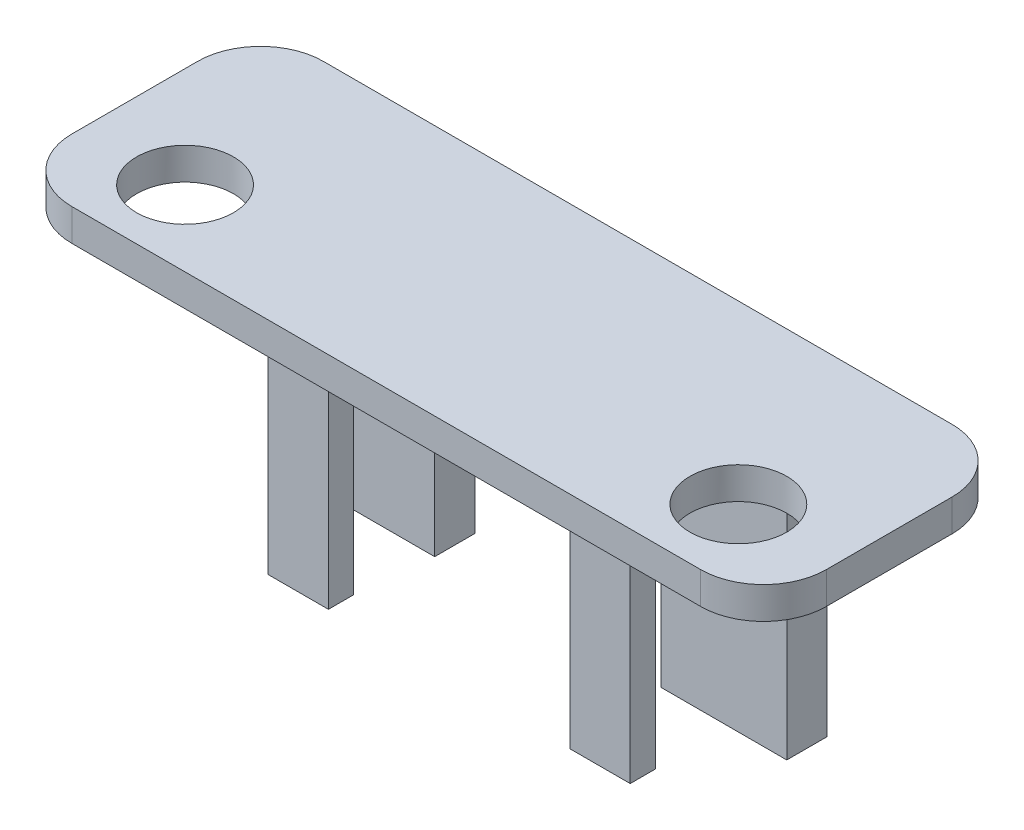
ISO-10303-21;
HEADER;
FILE_DESCRIPTION(('STEP AP214'),'2;1');
FILE_NAME('part.step','',(''),(''),'','','');
FILE_SCHEMA(('AUTOMOTIVE_DESIGN { 1 0 10303 214 1 1 1 1 }'));
ENDSEC;
DATA;
#1=APPLICATION_CONTEXT('core data for automotive mechanical design processes');
#2=APPLICATION_PROTOCOL_DEFINITION('international standard','automotive_design',2000,#1);
#3=PRODUCT_CONTEXT('',#1,'mechanical');
#4=PRODUCT('Part','Part','',(#3));
#5=PRODUCT_RELATED_PRODUCT_CATEGORY('part','',(#4));
#6=PRODUCT_DEFINITION_FORMATION('','',#4);
#7=PRODUCT_DEFINITION_CONTEXT('part definition',#1,'design');
#8=PRODUCT_DEFINITION('design','',#6,#7);
#9=PRODUCT_DEFINITION_SHAPE('','',#8);
#10=(LENGTH_UNIT() NAMED_UNIT(*) SI_UNIT(.MILLI.,.METRE.));
#11=(NAMED_UNIT(*) PLANE_ANGLE_UNIT() SI_UNIT($,.RADIAN.));
#12=(NAMED_UNIT(*) SI_UNIT($,.STERADIAN.) SOLID_ANGLE_UNIT());
#13=UNCERTAINTY_MEASURE_WITH_UNIT(LENGTH_MEASURE(1.E-05),#10,'distance_accuracy_value','');
#14=(GEOMETRIC_REPRESENTATION_CONTEXT(3) GLOBAL_UNCERTAINTY_ASSIGNED_CONTEXT((#13)) GLOBAL_UNIT_ASSIGNED_CONTEXT((#10,
#11,#12)) REPRESENTATION_CONTEXT('',''));
#15=CARTESIAN_POINT('',(0.,0.,0.));
#16=DIRECTION('',(0.,0.,1.));
#17=DIRECTION('',(1.,0.,0.));
#18=AXIS2_PLACEMENT_3D('',#15,#16,#17);
#19=CARTESIAN_POINT('',(0.,0.,0.));
#20=DIRECTION('',(0.,-1.,0.));
#21=DIRECTION('',(0.,0.,-1.));
#22=AXIS2_PLACEMENT_3D('',#19,#20,#21);
#23=PLANE('',#22);
#24=CARTESIAN_POINT('',(-22.,0.,4.));
#25=DIRECTION('',(0.,-1.,0.));
#26=DIRECTION('',(0.,0.,-1.));
#27=AXIS2_PLACEMENT_3D('',#24,#25,#26);
#28=CIRCLE('',#27,3.85);
#29=CARTESIAN_POINT('',(-22.,0.,0.150000000000001));
#30=VERTEX_POINT('',#29);
#31=EDGE_CURVE('E390',#30,#30,#28,.T.);
#32=ORIENTED_EDGE('',*,*,#31,.F.);
#33=EDGE_LOOP('',(#32));
#34=FACE_BOUND('',#33,.T.);
#35=CARTESIAN_POINT('',(22.,0.,4.));
#36=DIRECTION('',(0.,-1.,0.));
#37=DIRECTION('',(0.,0.,-1.));
#38=AXIS2_PLACEMENT_3D('',#35,#36,#37);
#39=CIRCLE('',#38,3.85);
#40=CARTESIAN_POINT('',(22.,0.,0.150000000000001));
#41=VERTEX_POINT('',#40);
#42=EDGE_CURVE('E365',#41,#41,#39,.T.);
#43=ORIENTED_EDGE('',*,*,#42,.F.);
#44=EDGE_LOOP('',(#43));
#45=FACE_BOUND('',#44,.T.);
#46=DIRECTION('',(0.,0.,1.));
#47=VECTOR('',#46,1.);
#48=CARTESIAN_POINT('',(-30.,0.,10.));
#49=LINE('',#48,#47);
#50=CARTESIAN_POINT('',(-30.,0.,-5.));
#51=VERTEX_POINT('',#50);
#52=CARTESIAN_POINT('',(-30.,0.,5.));
#53=VERTEX_POINT('',#52);
#54=EDGE_CURVE('E394',#51,#53,#49,.T.);
#55=ORIENTED_EDGE('',*,*,#54,.F.);
#56=CARTESIAN_POINT('',(-25.,0.,-5.));
#57=DIRECTION('',(0.,-1.,0.));
#58=DIRECTION('',(0.,0.,-1.));
#59=AXIS2_PLACEMENT_3D('',#56,#57,#58);
#60=CIRCLE('',#59,5.);
#61=CARTESIAN_POINT('',(-25.,0.,-10.));
#62=VERTEX_POINT('',#61);
#63=EDGE_CURVE('E421',#51,#62,#60,.T.);
#64=ORIENTED_EDGE('',*,*,#63,.T.);
#65=DIRECTION('',(-1.,0.,0.));
#66=VECTOR('',#65,1.);
#67=CARTESIAN_POINT('',(-30.,0.,-10.));
#68=LINE('',#67,#66);
#69=CARTESIAN_POINT('',(25.,0.,-10.));
#70=VERTEX_POINT('',#69);
#71=EDGE_CURVE('E389',#70,#62,#68,.T.);
#72=ORIENTED_EDGE('',*,*,#71,.F.);
#73=CARTESIAN_POINT('',(25.,0.,-5.));
#74=DIRECTION('',(0.,-1.,0.));
#75=DIRECTION('',(0.,0.,-1.));
#76=AXIS2_PLACEMENT_3D('',#73,#74,#75);
#77=CIRCLE('',#76,5.);
#78=CARTESIAN_POINT('',(30.,0.,-5.));
#79=VERTEX_POINT('',#78);
#80=EDGE_CURVE('E412',#70,#79,#77,.T.);
#81=ORIENTED_EDGE('',*,*,#80,.T.);
#82=DIRECTION('',(0.,0.,-1.));
#83=VECTOR('',#82,1.);
#84=CARTESIAN_POINT('',(30.,0.,10.));
#85=LINE('',#84,#83);
#86=CARTESIAN_POINT('',(30.,0.,5.));
#87=VERTEX_POINT('',#86);
#88=EDGE_CURVE('E385',#87,#79,#85,.T.);
#89=ORIENTED_EDGE('',*,*,#88,.F.);
#90=CARTESIAN_POINT('',(25.,0.,5.));
#91=DIRECTION('',(0.,-1.,0.));
#92=DIRECTION('',(0.,0.,-1.));
#93=AXIS2_PLACEMENT_3D('',#90,#91,#92);
#94=CIRCLE('',#93,5.);
#95=CARTESIAN_POINT('',(25.,0.,10.));
#96=VERTEX_POINT('',#95);
#97=EDGE_CURVE('E415',#87,#96,#94,.T.);
#98=ORIENTED_EDGE('',*,*,#97,.T.);
#99=DIRECTION('',(1.,0.,0.));
#100=VECTOR('',#99,1.);
#101=CARTESIAN_POINT('',(-30.,0.,10.));
#102=LINE('',#101,#100);
#103=CARTESIAN_POINT('',(-25.,0.,10.));
#104=VERTEX_POINT('',#103);
#105=EDGE_CURVE('E374',#104,#96,#102,.T.);
#106=ORIENTED_EDGE('',*,*,#105,.F.);
#107=CARTESIAN_POINT('',(-25.,0.,5.));
#108=DIRECTION('',(0.,-1.,0.));
#109=DIRECTION('',(0.,0.,-1.));
#110=AXIS2_PLACEMENT_3D('',#107,#108,#109);
#111=CIRCLE('',#110,5.);
#112=EDGE_CURVE('E418',#104,#53,#111,.T.);
#113=ORIENTED_EDGE('',*,*,#112,.T.);
#114=EDGE_LOOP('',(#55,#64,#72,#81,#89,#98,#106,#113));
#115=FACE_BOUND('',#114,.T.);
#116=DIRECTION('',(-1.,0.,0.));
#117=VECTOR('',#116,1.);
#118=CARTESIAN_POINT('',(-14.4,0.,5.));
#119=LINE('',#118,#117);
#120=CARTESIAN_POINT('',(-9.6,0.,5.));
#121=VERTEX_POINT('',#120);
#122=CARTESIAN_POINT('',(-14.4,0.,5.));
#123=VERTEX_POINT('',#122);
#124=EDGE_CURVE('E338',#121,#123,#119,.T.);
#125=ORIENTED_EDGE('',*,*,#124,.F.);
#126=DIRECTION('',(0.,0.,1.));
#127=VECTOR('',#126,1.);
#128=CARTESIAN_POINT('',(-9.6,0.,3.));
#129=LINE('',#128,#127);
#130=CARTESIAN_POINT('',(-9.6,0.,3.));
#131=VERTEX_POINT('',#130);
#132=EDGE_CURVE('E319',#131,#121,#129,.T.);
#133=ORIENTED_EDGE('',*,*,#132,.F.);
#134=DIRECTION('',(1.,0.,0.));
#135=VECTOR('',#134,1.);
#136=CARTESIAN_POINT('',(-14.4,0.,3.));
#137=LINE('',#136,#135);
#138=CARTESIAN_POINT('',(-14.4,0.,3.));
#139=VERTEX_POINT('',#138);
#140=EDGE_CURVE('E325',#139,#131,#137,.T.);
#141=ORIENTED_EDGE('',*,*,#140,.F.);
#142=DIRECTION('',(0.,0.,-1.));
#143=VECTOR('',#142,1.);
#144=CARTESIAN_POINT('',(-14.4,0.,3.));
#145=LINE('',#144,#143);
#146=EDGE_CURVE('E341',#123,#139,#145,.T.);
#147=ORIENTED_EDGE('',*,*,#146,.F.);
#148=EDGE_LOOP('',(#125,#133,#141,#147));
#149=FACE_BOUND('',#148,.T.);
#150=DIRECTION('',(-1.,0.,0.));
#151=VECTOR('',#150,1.);
#152=CARTESIAN_POINT('',(9.6,0.,5.));
#153=LINE('',#152,#151);
#154=CARTESIAN_POINT('',(14.4,0.,5.));
#155=VERTEX_POINT('',#154);
#156=CARTESIAN_POINT('',(9.6,0.,5.));
#157=VERTEX_POINT('',#156);
#158=EDGE_CURVE('E297',#155,#157,#153,.T.);
#159=ORIENTED_EDGE('',*,*,#158,.F.);
#160=DIRECTION('',(0.,0.,1.));
#161=VECTOR('',#160,1.);
#162=CARTESIAN_POINT('',(14.4,0.,3.));
#163=LINE('',#162,#161);
#164=CARTESIAN_POINT('',(14.4,0.,3.));
#165=VERTEX_POINT('',#164);
#166=EDGE_CURVE('E278',#165,#155,#163,.T.);
#167=ORIENTED_EDGE('',*,*,#166,.F.);
#168=DIRECTION('',(1.,0.,0.));
#169=VECTOR('',#168,1.);
#170=CARTESIAN_POINT('',(9.6,0.,3.));
#171=LINE('',#170,#169);
#172=CARTESIAN_POINT('',(9.6,0.,3.));
#173=VERTEX_POINT('',#172);
#174=EDGE_CURVE('E284',#173,#165,#171,.T.);
#175=ORIENTED_EDGE('',*,*,#174,.F.);
#176=DIRECTION('',(0.,0.,-1.));
#177=VECTOR('',#176,1.);
#178=CARTESIAN_POINT('',(9.6,0.,3.));
#179=LINE('',#178,#177);
#180=EDGE_CURVE('E300',#157,#173,#179,.T.);
#181=ORIENTED_EDGE('',*,*,#180,.F.);
#182=EDGE_LOOP('',(#159,#167,#175,#181));
#183=FACE_BOUND('',#182,.T.);
#184=DIRECTION('',(1.,0.,0.));
#185=VECTOR('',#184,1.);
#186=CARTESIAN_POINT('',(-19.,0.,-6.05));
#187=LINE('',#186,#185);
#188=CARTESIAN_POINT('',(-19.,0.,-6.05));
#189=VERTEX_POINT('',#188);
#190=CARTESIAN_POINT('',(-9.,0.,-6.05));
#191=VERTEX_POINT('',#190);
#192=EDGE_CURVE('E236',#189,#191,#187,.T.);
#193=ORIENTED_EDGE('',*,*,#192,.F.);
#194=DIRECTION('',(0.,0.,-1.));
#195=VECTOR('',#194,1.);
#196=CARTESIAN_POINT('',(-19.,0.,-6.05));
#197=LINE('',#196,#195);
#198=CARTESIAN_POINT('',(-19.,0.,-2.85));
#199=VERTEX_POINT('',#198);
#200=EDGE_CURVE('E231',#199,#189,#197,.T.);
#201=ORIENTED_EDGE('',*,*,#200,.F.);
#202=DIRECTION('',(-1.,0.,0.));
#203=VECTOR('',#202,1.);
#204=CARTESIAN_POINT('',(-19.,0.,-2.85));
#205=LINE('',#204,#203);
#206=CARTESIAN_POINT('',(-9.,0.,-2.85));
#207=VERTEX_POINT('',#206);
#208=EDGE_CURVE('E247',#207,#199,#205,.T.);
#209=ORIENTED_EDGE('',*,*,#208,.F.);
#210=DIRECTION('',(0.,0.,1.));
#211=VECTOR('',#210,1.);
#212=CARTESIAN_POINT('',(-9.,0.,-6.05));
#213=LINE('',#212,#211);
#214=EDGE_CURVE('E259',#191,#207,#213,.T.);
#215=ORIENTED_EDGE('',*,*,#214,.F.);
#216=EDGE_LOOP('',(#193,#201,#209,#215));
#217=FACE_BOUND('',#216,.T.);
#218=DIRECTION('',(0.,0.,-1.));
#219=VECTOR('',#218,1.);
#220=CARTESIAN_POINT('',(9.,0.,-6.05));
#221=LINE('',#220,#219);
#222=CARTESIAN_POINT('',(9.,0.,-2.85));
#223=VERTEX_POINT('',#222);
#224=CARTESIAN_POINT('',(9.,0.,-6.05));
#225=VERTEX_POINT('',#224);
#226=EDGE_CURVE('E805',#223,#225,#221,.T.);
#227=ORIENTED_EDGE('',*,*,#226,.F.);
#228=DIRECTION('',(-1.,0.,0.));
#229=VECTOR('',#228,1.);
#230=CARTESIAN_POINT('',(9.,0.,-2.85));
#231=LINE('',#230,#229);
#232=CARTESIAN_POINT('',(19.,0.,-2.85));
#233=VERTEX_POINT('',#232);
#234=EDGE_CURVE('E228',#233,#223,#231,.T.);
#235=ORIENTED_EDGE('',*,*,#234,.F.);
#236=DIRECTION('',(0.,0.,1.));
#237=VECTOR('',#236,1.);
#238=CARTESIAN_POINT('',(19.,0.,-6.05));
#239=LINE('',#238,#237);
#240=CARTESIAN_POINT('',(19.,0.,-6.05));
#241=VERTEX_POINT('',#240);
#242=EDGE_CURVE('E224',#241,#233,#239,.T.);
#243=ORIENTED_EDGE('',*,*,#242,.F.);
#244=DIRECTION('',(1.,0.,0.));
#245=VECTOR('',#244,1.);
#246=CARTESIAN_POINT('',(9.,0.,-6.05));
#247=LINE('',#246,#245);
#248=EDGE_CURVE('E808',#225,#241,#247,.T.);
#249=ORIENTED_EDGE('',*,*,#248,.F.);
#250=EDGE_LOOP('',(#227,#235,#243,#249));
#251=FACE_BOUND('',#250,.T.);
#252=ADVANCED_FACE('F39',(#34,#45,#115,#149,#183,#217,#251),#23,.T.);
#253=CARTESIAN_POINT('',(30.,2.54,10.));
#254=DIRECTION('',(-1.,0.,0.));
#255=DIRECTION('',(0.,0.,1.));
#256=AXIS2_PLACEMENT_3D('',#253,#254,#255);
#257=PLANE('',#256);
#258=DIRECTION('',(0.,0.,-1.));
#259=VECTOR('',#258,1.);
#260=CARTESIAN_POINT('',(30.,2.54,10.));
#261=LINE('',#260,#259);
#262=CARTESIAN_POINT('',(30.,2.54,5.));
#263=VERTEX_POINT('',#262);
#264=CARTESIAN_POINT('',(30.,2.54,-5.));
#265=VERTEX_POINT('',#264);
#266=EDGE_CURVE('E369',#263,#265,#261,.T.);
#267=ORIENTED_EDGE('',*,*,#266,.F.);
#268=DIRECTION('',(0.,-1.,0.));
#269=VECTOR('',#268,1.);
#270=CARTESIAN_POINT('',(30.,2.54,5.));
#271=LINE('',#270,#269);
#272=EDGE_CURVE('E11',#263,#87,#271,.T.);
#273=ORIENTED_EDGE('',*,*,#272,.T.);
#274=ORIENTED_EDGE('',*,*,#88,.T.);
#275=DIRECTION('',(0.,-1.,0.));
#276=VECTOR('',#275,1.);
#277=CARTESIAN_POINT('',(30.,2.54,-5.));
#278=LINE('',#277,#276);
#279=EDGE_CURVE('E48',#79,#265,#278,.F.);
#280=ORIENTED_EDGE('',*,*,#279,.T.);
#281=EDGE_LOOP('',(#267,#273,#274,#280));
#282=FACE_BOUND('',#281,.T.);
#283=ADVANCED_FACE('F451',(#282),#257,.F.);
#284=CARTESIAN_POINT('',(-30.,2.54,-10.));
#285=DIRECTION('',(0.,0.,1.));
#286=DIRECTION('',(1.,0.,0.));
#287=AXIS2_PLACEMENT_3D('',#284,#285,#286);
#288=PLANE('',#287);
#289=ORIENTED_EDGE('',*,*,#71,.T.);
#290=DIRECTION('',(0.,-1.,0.));
#291=VECTOR('',#290,1.);
#292=CARTESIAN_POINT('',(-25.,2.54,-10.));
#293=LINE('',#292,#291);
#294=CARTESIAN_POINT('',(-25.,2.54,-10.));
#295=VERTEX_POINT('',#294);
#296=EDGE_CURVE('E428',#62,#295,#293,.F.);
#297=ORIENTED_EDGE('',*,*,#296,.T.);
#298=DIRECTION('',(-1.,0.,0.));
#299=VECTOR('',#298,1.);
#300=CARTESIAN_POINT('',(-30.,2.54,-10.));
#301=LINE('',#300,#299);
#302=CARTESIAN_POINT('',(25.,2.54,-10.));
#303=VERTEX_POINT('',#302);
#304=EDGE_CURVE('E373',#303,#295,#301,.T.);
#305=ORIENTED_EDGE('',*,*,#304,.F.);
#306=DIRECTION('',(0.,-1.,0.));
#307=VECTOR('',#306,1.);
#308=CARTESIAN_POINT('',(25.,2.54,-10.));
#309=LINE('',#308,#307);
#310=EDGE_CURVE('E424',#303,#70,#309,.T.);
#311=ORIENTED_EDGE('',*,*,#310,.T.);
#312=EDGE_LOOP('',(#289,#297,#305,#311));
#313=FACE_BOUND('',#312,.T.);
#314=ADVANCED_FACE('F462',(#313),#288,.F.);
#315=CARTESIAN_POINT('',(-30.,2.54,10.));
#316=DIRECTION('',(1.,0.,0.));
#317=DIRECTION('',(0.,0.,-1.));
#318=AXIS2_PLACEMENT_3D('',#315,#316,#317);
#319=PLANE('',#318);
#320=DIRECTION('',(0.,0.,1.));
#321=VECTOR('',#320,1.);
#322=CARTESIAN_POINT('',(-30.,2.54,10.));
#323=LINE('',#322,#321);
#324=CARTESIAN_POINT('',(-30.,2.54,-5.));
#325=VERTEX_POINT('',#324);
#326=CARTESIAN_POINT('',(-30.,2.54,5.));
#327=VERTEX_POINT('',#326);
#328=EDGE_CURVE('E378',#325,#327,#323,.T.);
#329=ORIENTED_EDGE('',*,*,#328,.F.);
#330=DIRECTION('',(0.,-1.,0.));
#331=VECTOR('',#330,1.);
#332=CARTESIAN_POINT('',(-30.,2.54,-5.));
#333=LINE('',#332,#331);
#334=EDGE_CURVE('E408',#325,#51,#333,.T.);
#335=ORIENTED_EDGE('',*,*,#334,.T.);
#336=ORIENTED_EDGE('',*,*,#54,.T.);
#337=DIRECTION('',(0.,-1.,0.));
#338=VECTOR('',#337,1.);
#339=CARTESIAN_POINT('',(-30.,2.54,5.));
#340=LINE('',#339,#338);
#341=EDGE_CURVE('E384',#53,#327,#340,.F.);
#342=ORIENTED_EDGE('',*,*,#341,.T.);
#343=EDGE_LOOP('',(#329,#335,#336,#342));
#344=FACE_BOUND('',#343,.T.);
#345=ADVANCED_FACE('F473',(#344),#319,.F.);
#346=CARTESIAN_POINT('',(-30.,2.54,10.));
#347=DIRECTION('',(0.,0.,-1.));
#348=DIRECTION('',(-1.,0.,0.));
#349=AXIS2_PLACEMENT_3D('',#346,#347,#348);
#350=PLANE('',#349);
#351=DIRECTION('',(1.,0.,0.));
#352=VECTOR('',#351,1.);
#353=CARTESIAN_POINT('',(-30.,2.54,10.));
#354=LINE('',#353,#352);
#355=CARTESIAN_POINT('',(-25.,2.54,10.));
#356=VERTEX_POINT('',#355);
#357=CARTESIAN_POINT('',(25.,2.54,10.));
#358=VERTEX_POINT('',#357);
#359=EDGE_CURVE('E381',#356,#358,#354,.T.);
#360=ORIENTED_EDGE('',*,*,#359,.F.);
#361=DIRECTION('',(0.,-1.,0.));
#362=VECTOR('',#361,1.);
#363=CARTESIAN_POINT('',(-25.,2.54,10.));
#364=LINE('',#363,#362);
#365=EDGE_CURVE('E444',#356,#104,#364,.T.);
#366=ORIENTED_EDGE('',*,*,#365,.T.);
#367=ORIENTED_EDGE('',*,*,#105,.T.);
#368=DIRECTION('',(0.,-1.,0.));
#369=VECTOR('',#368,1.);
#370=CARTESIAN_POINT('',(25.,2.54,10.));
#371=LINE('',#370,#369);
#372=EDGE_CURVE('E55',#96,#358,#371,.F.);
#373=ORIENTED_EDGE('',*,*,#372,.T.);
#374=EDGE_LOOP('',(#360,#366,#367,#373));
#375=FACE_BOUND('',#374,.T.);
#376=ADVANCED_FACE('F479',(#375),#350,.F.);
#377=CARTESIAN_POINT('',(0.,2.54,0.));
#378=DIRECTION('',(0.,-1.,0.));
#379=DIRECTION('',(0.,0.,-1.));
#380=AXIS2_PLACEMENT_3D('',#377,#378,#379);
#381=PLANE('',#380);
#382=CARTESIAN_POINT('',(-22.,2.54,4.));
#383=DIRECTION('',(0.,1.,0.));
#384=DIRECTION('',(0.,0.,1.));
#385=AXIS2_PLACEMENT_3D('',#382,#383,#384);
#386=CIRCLE('',#385,3.85);
#387=CARTESIAN_POINT('',(-22.,2.54,7.85));
#388=VERTEX_POINT('',#387);
#389=EDGE_CURVE('E361',#388,#388,#386,.T.);
#390=ORIENTED_EDGE('',*,*,#389,.F.);
#391=EDGE_LOOP('',(#390));
#392=FACE_BOUND('',#391,.T.);
#393=CARTESIAN_POINT('',(22.,2.54,4.));
#394=DIRECTION('',(0.,1.,0.));
#395=DIRECTION('',(0.,0.,1.));
#396=AXIS2_PLACEMENT_3D('',#393,#394,#395);
#397=CIRCLE('',#396,3.85);
#398=CARTESIAN_POINT('',(22.,2.54,7.85));
#399=VERTEX_POINT('',#398);
#400=EDGE_CURVE('E360',#399,#399,#397,.T.);
#401=ORIENTED_EDGE('',*,*,#400,.F.);
#402=EDGE_LOOP('',(#401));
#403=FACE_BOUND('',#402,.T.);
#404=ORIENTED_EDGE('',*,*,#304,.T.);
#405=CARTESIAN_POINT('',(-25.,2.54,-5.));
#406=DIRECTION('',(0.,-1.,0.));
#407=DIRECTION('',(0.,0.,-1.));
#408=AXIS2_PLACEMENT_3D('',#405,#406,#407);
#409=CIRCLE('',#408,5.);
#410=EDGE_CURVE('E439',#295,#325,#409,.F.);
#411=ORIENTED_EDGE('',*,*,#410,.T.);
#412=ORIENTED_EDGE('',*,*,#328,.T.);
#413=CARTESIAN_POINT('',(-25.,2.54,5.));
#414=DIRECTION('',(0.,-1.,0.));
#415=DIRECTION('',(0.,0.,-1.));
#416=AXIS2_PLACEMENT_3D('',#413,#414,#415);
#417=CIRCLE('',#416,5.);
#418=EDGE_CURVE('E62',#327,#356,#417,.F.);
#419=ORIENTED_EDGE('',*,*,#418,.T.);
#420=ORIENTED_EDGE('',*,*,#359,.T.);
#421=CARTESIAN_POINT('',(25.,2.54,5.));
#422=DIRECTION('',(0.,-1.,0.));
#423=DIRECTION('',(0.,0.,-1.));
#424=AXIS2_PLACEMENT_3D('',#421,#422,#423);
#425=CIRCLE('',#424,5.);
#426=EDGE_CURVE('E434',#358,#263,#425,.F.);
#427=ORIENTED_EDGE('',*,*,#426,.T.);
#428=ORIENTED_EDGE('',*,*,#266,.T.);
#429=CARTESIAN_POINT('',(25.,2.54,-5.));
#430=DIRECTION('',(0.,-1.,0.));
#431=DIRECTION('',(0.,0.,-1.));
#432=AXIS2_PLACEMENT_3D('',#429,#430,#431);
#433=CIRCLE('',#432,5.);
#434=EDGE_CURVE('E431',#265,#303,#433,.F.);
#435=ORIENTED_EDGE('',*,*,#434,.T.);
#436=EDGE_LOOP('',(#404,#411,#412,#419,#420,#427,#428,#435));
#437=FACE_BOUND('',#436,.T.);
#438=ADVANCED_FACE('F456',(#392,#403,#437),#381,.F.);
#439=CARTESIAN_POINT('',(22.,-7.46,4.));
#440=DIRECTION('',(0.,1.,0.));
#441=DIRECTION('',(0.,0.,1.));
#442=AXIS2_PLACEMENT_3D('',#439,#440,#441);
#443=CYLINDRICAL_SURFACE('',#442,3.85);
#444=ORIENTED_EDGE('',*,*,#42,.T.);
#445=EDGE_LOOP('',(#444));
#446=FACE_BOUND('',#445,.T.);
#447=ORIENTED_EDGE('',*,*,#400,.T.);
#448=EDGE_LOOP('',(#447));
#449=FACE_BOUND('',#448,.T.);
#450=ADVANCED_FACE('F588',(#446,#449),#443,.F.);
#451=CARTESIAN_POINT('',(-22.,-7.46,4.));
#452=DIRECTION('',(0.,1.,0.));
#453=DIRECTION('',(0.,0.,1.));
#454=AXIS2_PLACEMENT_3D('',#451,#452,#453);
#455=CYLINDRICAL_SURFACE('',#454,3.85);
#456=ORIENTED_EDGE('',*,*,#31,.T.);
#457=EDGE_LOOP('',(#456));
#458=FACE_BOUND('',#457,.T.);
#459=ORIENTED_EDGE('',*,*,#389,.T.);
#460=EDGE_LOOP('',(#459));
#461=FACE_BOUND('',#460,.T.);
#462=ADVANCED_FACE('F585',(#458,#461),#455,.F.);
#463=CARTESIAN_POINT('',(-9.6,-20.,3.));
#464=DIRECTION('',(-1.,0.,0.));
#465=DIRECTION('',(0.,0.,1.));
#466=AXIS2_PLACEMENT_3D('',#463,#464,#465);
#467=PLANE('',#466);
#468=ORIENTED_EDGE('',*,*,#132,.T.);
#469=DIRECTION('',(0.,1.,0.));
#470=VECTOR('',#469,1.);
#471=CARTESIAN_POINT('',(-9.6,-20.,5.));
#472=LINE('',#471,#470);
#473=CARTESIAN_POINT('',(-9.6,-20.,5.));
#474=VERTEX_POINT('',#473);
#475=EDGE_CURVE('E357',#474,#121,#472,.T.);
#476=ORIENTED_EDGE('',*,*,#475,.F.);
#477=DIRECTION('',(0.,0.,1.));
#478=VECTOR('',#477,1.);
#479=CARTESIAN_POINT('',(-9.6,-20.,3.));
#480=LINE('',#479,#478);
#481=CARTESIAN_POINT('',(-9.6,-20.,3.));
#482=VERTEX_POINT('',#481);
#483=EDGE_CURVE('E320',#482,#474,#480,.T.);
#484=ORIENTED_EDGE('',*,*,#483,.F.);
#485=DIRECTION('',(0.,1.,0.));
#486=VECTOR('',#485,1.);
#487=CARTESIAN_POINT('',(-9.6,-20.,3.));
#488=LINE('',#487,#486);
#489=EDGE_CURVE('E334',#482,#131,#488,.T.);
#490=ORIENTED_EDGE('',*,*,#489,.T.);
#491=EDGE_LOOP('',(#468,#476,#484,#490));
#492=FACE_BOUND('',#491,.T.);
#493=ADVANCED_FACE('F581',(#492),#467,.F.);
#494=CARTESIAN_POINT('',(-14.4,-20.,5.));
#495=DIRECTION('',(0.,0.,-1.));
#496=DIRECTION('',(-1.,0.,0.));
#497=AXIS2_PLACEMENT_3D('',#494,#495,#496);
#498=PLANE('',#497);
#499=ORIENTED_EDGE('',*,*,#124,.T.);
#500=DIRECTION('',(0.,1.,0.));
#501=VECTOR('',#500,1.);
#502=CARTESIAN_POINT('',(-14.4,-20.,5.));
#503=LINE('',#502,#501);
#504=CARTESIAN_POINT('',(-14.4,-20.,5.));
#505=VERTEX_POINT('',#504);
#506=EDGE_CURVE('E353',#505,#123,#503,.T.);
#507=ORIENTED_EDGE('',*,*,#506,.F.);
#508=DIRECTION('',(-1.,0.,0.));
#509=VECTOR('',#508,1.);
#510=CARTESIAN_POINT('',(-14.4,-20.,5.));
#511=LINE('',#510,#509);
#512=EDGE_CURVE('E324',#474,#505,#511,.T.);
#513=ORIENTED_EDGE('',*,*,#512,.F.);
#514=ORIENTED_EDGE('',*,*,#475,.T.);
#515=EDGE_LOOP('',(#499,#507,#513,#514));
#516=FACE_BOUND('',#515,.T.);
#517=ADVANCED_FACE('F577',(#516),#498,.F.);
#518=CARTESIAN_POINT('',(-14.4,-20.,3.));
#519=DIRECTION('',(1.,0.,0.));
#520=DIRECTION('',(0.,0.,-1.));
#521=AXIS2_PLACEMENT_3D('',#518,#519,#520);
#522=PLANE('',#521);
#523=ORIENTED_EDGE('',*,*,#146,.T.);
#524=DIRECTION('',(0.,1.,0.));
#525=VECTOR('',#524,1.);
#526=CARTESIAN_POINT('',(-14.4,-20.,3.));
#527=LINE('',#526,#525);
#528=CARTESIAN_POINT('',(-14.4,-20.,3.));
#529=VERTEX_POINT('',#528);
#530=EDGE_CURVE('E350',#529,#139,#527,.T.);
#531=ORIENTED_EDGE('',*,*,#530,.F.);
#532=DIRECTION('',(0.,0.,-1.));
#533=VECTOR('',#532,1.);
#534=CARTESIAN_POINT('',(-14.4,-20.,3.));
#535=LINE('',#534,#533);
#536=EDGE_CURVE('E328',#505,#529,#535,.T.);
#537=ORIENTED_EDGE('',*,*,#536,.F.);
#538=ORIENTED_EDGE('',*,*,#506,.T.);
#539=EDGE_LOOP('',(#523,#531,#537,#538));
#540=FACE_BOUND('',#539,.T.);
#541=ADVANCED_FACE('F573',(#540),#522,.F.);
#542=CARTESIAN_POINT('',(-14.4,-20.,3.));
#543=DIRECTION('',(0.,0.,1.));
#544=DIRECTION('',(1.,0.,0.));
#545=AXIS2_PLACEMENT_3D('',#542,#543,#544);
#546=PLANE('',#545);
#547=ORIENTED_EDGE('',*,*,#140,.T.);
#548=ORIENTED_EDGE('',*,*,#489,.F.);
#549=DIRECTION('',(1.,0.,0.));
#550=VECTOR('',#549,1.);
#551=CARTESIAN_POINT('',(-14.4,-20.,3.));
#552=LINE('',#551,#550);
#553=EDGE_CURVE('E331',#529,#482,#552,.T.);
#554=ORIENTED_EDGE('',*,*,#553,.F.);
#555=ORIENTED_EDGE('',*,*,#530,.T.);
#556=EDGE_LOOP('',(#547,#548,#554,#555));
#557=FACE_BOUND('',#556,.T.);
#558=ADVANCED_FACE('F569',(#557),#546,.F.);
#559=CARTESIAN_POINT('',(0.,-20.,0.));
#560=DIRECTION('',(0.,1.,0.));
#561=DIRECTION('',(0.,0.,1.));
#562=AXIS2_PLACEMENT_3D('',#559,#560,#561);
#563=PLANE('',#562);
#564=ORIENTED_EDGE('',*,*,#483,.T.);
#565=ORIENTED_EDGE('',*,*,#512,.T.);
#566=ORIENTED_EDGE('',*,*,#536,.T.);
#567=ORIENTED_EDGE('',*,*,#553,.T.);
#568=EDGE_LOOP('',(#564,#565,#566,#567));
#569=FACE_BOUND('',#568,.T.);
#570=ADVANCED_FACE('F565',(#569),#563,.F.);
#571=CARTESIAN_POINT('',(14.4,-20.,3.));
#572=DIRECTION('',(-1.,0.,0.));
#573=DIRECTION('',(0.,0.,1.));
#574=AXIS2_PLACEMENT_3D('',#571,#572,#573);
#575=PLANE('',#574);
#576=ORIENTED_EDGE('',*,*,#166,.T.);
#577=DIRECTION('',(0.,1.,0.));
#578=VECTOR('',#577,1.);
#579=CARTESIAN_POINT('',(14.4,-20.,5.));
#580=LINE('',#579,#578);
#581=CARTESIAN_POINT('',(14.4,-20.,5.));
#582=VERTEX_POINT('',#581);
#583=EDGE_CURVE('E316',#582,#155,#580,.T.);
#584=ORIENTED_EDGE('',*,*,#583,.F.);
#585=DIRECTION('',(0.,0.,1.));
#586=VECTOR('',#585,1.);
#587=CARTESIAN_POINT('',(14.4,-20.,3.));
#588=LINE('',#587,#586);
#589=CARTESIAN_POINT('',(14.4,-20.,3.));
#590=VERTEX_POINT('',#589);
#591=EDGE_CURVE('E279',#590,#582,#588,.T.);
#592=ORIENTED_EDGE('',*,*,#591,.F.);
#593=DIRECTION('',(0.,1.,0.));
#594=VECTOR('',#593,1.);
#595=CARTESIAN_POINT('',(14.4,-20.,3.));
#596=LINE('',#595,#594);
#597=EDGE_CURVE('E293',#590,#165,#596,.T.);
#598=ORIENTED_EDGE('',*,*,#597,.T.);
#599=EDGE_LOOP('',(#576,#584,#592,#598));
#600=FACE_BOUND('',#599,.T.);
#601=ADVANCED_FACE('F561',(#600),#575,.F.);
#602=CARTESIAN_POINT('',(9.6,-20.,5.));
#603=DIRECTION('',(0.,0.,-1.));
#604=DIRECTION('',(-1.,0.,0.));
#605=AXIS2_PLACEMENT_3D('',#602,#603,#604);
#606=PLANE('',#605);
#607=ORIENTED_EDGE('',*,*,#158,.T.);
#608=DIRECTION('',(0.,1.,0.));
#609=VECTOR('',#608,1.);
#610=CARTESIAN_POINT('',(9.6,-20.,5.));
#611=LINE('',#610,#609);
#612=CARTESIAN_POINT('',(9.6,-20.,5.));
#613=VERTEX_POINT('',#612);
#614=EDGE_CURVE('E312',#613,#157,#611,.T.);
#615=ORIENTED_EDGE('',*,*,#614,.F.);
#616=DIRECTION('',(-1.,0.,0.));
#617=VECTOR('',#616,1.);
#618=CARTESIAN_POINT('',(9.6,-20.,5.));
#619=LINE('',#618,#617);
#620=EDGE_CURVE('E283',#582,#613,#619,.T.);
#621=ORIENTED_EDGE('',*,*,#620,.F.);
#622=ORIENTED_EDGE('',*,*,#583,.T.);
#623=EDGE_LOOP('',(#607,#615,#621,#622));
#624=FACE_BOUND('',#623,.T.);
#625=ADVANCED_FACE('F557',(#624),#606,.F.);
#626=CARTESIAN_POINT('',(9.6,-20.,3.));
#627=DIRECTION('',(1.,0.,0.));
#628=DIRECTION('',(0.,0.,-1.));
#629=AXIS2_PLACEMENT_3D('',#626,#627,#628);
#630=PLANE('',#629);
#631=ORIENTED_EDGE('',*,*,#180,.T.);
#632=DIRECTION('',(0.,1.,0.));
#633=VECTOR('',#632,1.);
#634=CARTESIAN_POINT('',(9.6,-20.,3.));
#635=LINE('',#634,#633);
#636=CARTESIAN_POINT('',(9.6,-20.,3.));
#637=VERTEX_POINT('',#636);
#638=EDGE_CURVE('E309',#637,#173,#635,.T.);
#639=ORIENTED_EDGE('',*,*,#638,.F.);
#640=DIRECTION('',(0.,0.,-1.));
#641=VECTOR('',#640,1.);
#642=CARTESIAN_POINT('',(9.6,-20.,3.));
#643=LINE('',#642,#641);
#644=EDGE_CURVE('E287',#613,#637,#643,.T.);
#645=ORIENTED_EDGE('',*,*,#644,.F.);
#646=ORIENTED_EDGE('',*,*,#614,.T.);
#647=EDGE_LOOP('',(#631,#639,#645,#646));
#648=FACE_BOUND('',#647,.T.);
#649=ADVANCED_FACE('F553',(#648),#630,.F.);
#650=CARTESIAN_POINT('',(9.6,-20.,3.));
#651=DIRECTION('',(0.,0.,1.));
#652=DIRECTION('',(1.,0.,0.));
#653=AXIS2_PLACEMENT_3D('',#650,#651,#652);
#654=PLANE('',#653);
#655=ORIENTED_EDGE('',*,*,#174,.T.);
#656=ORIENTED_EDGE('',*,*,#597,.F.);
#657=DIRECTION('',(1.,0.,0.));
#658=VECTOR('',#657,1.);
#659=CARTESIAN_POINT('',(9.6,-20.,3.));
#660=LINE('',#659,#658);
#661=EDGE_CURVE('E290',#637,#590,#660,.T.);
#662=ORIENTED_EDGE('',*,*,#661,.F.);
#663=ORIENTED_EDGE('',*,*,#638,.T.);
#664=EDGE_LOOP('',(#655,#656,#662,#663));
#665=FACE_BOUND('',#664,.T.);
#666=ADVANCED_FACE('F549',(#665),#654,.F.);
#667=CARTESIAN_POINT('',(0.,-20.,0.));
#668=DIRECTION('',(0.,1.,0.));
#669=DIRECTION('',(0.,0.,1.));
#670=AXIS2_PLACEMENT_3D('',#667,#668,#669);
#671=PLANE('',#670);
#672=ORIENTED_EDGE('',*,*,#591,.T.);
#673=ORIENTED_EDGE('',*,*,#620,.T.);
#674=ORIENTED_EDGE('',*,*,#644,.T.);
#675=ORIENTED_EDGE('',*,*,#661,.T.);
#676=EDGE_LOOP('',(#672,#673,#674,#675));
#677=FACE_BOUND('',#676,.T.);
#678=ADVANCED_FACE('F545',(#677),#671,.F.);
#679=CARTESIAN_POINT('',(-19.,-20.,-6.05));
#680=DIRECTION('',(1.,0.,0.));
#681=DIRECTION('',(0.,0.,-1.));
#682=AXIS2_PLACEMENT_3D('',#679,#680,#681);
#683=PLANE('',#682);
#684=ORIENTED_EDGE('',*,*,#200,.T.);
#685=DIRECTION('',(0.,1.,0.));
#686=VECTOR('',#685,1.);
#687=CARTESIAN_POINT('',(-19.,-20.,-6.05));
#688=LINE('',#687,#686);
#689=CARTESIAN_POINT('',(-19.,-20.,-6.05));
#690=VERTEX_POINT('',#689);
#691=EDGE_CURVE('E275',#690,#189,#688,.T.);
#692=ORIENTED_EDGE('',*,*,#691,.F.);
#693=DIRECTION('',(0.,0.,-1.));
#694=VECTOR('',#693,1.);
#695=CARTESIAN_POINT('',(-19.,-20.,-6.05));
#696=LINE('',#695,#694);
#697=CARTESIAN_POINT('',(-19.,-20.,-2.85));
#698=VERTEX_POINT('',#697);
#699=EDGE_CURVE('E242',#698,#690,#696,.T.);
#700=ORIENTED_EDGE('',*,*,#699,.F.);
#701=DIRECTION('',(0.,1.,0.));
#702=VECTOR('',#701,1.);
#703=CARTESIAN_POINT('',(-19.,-20.,-2.85));
#704=LINE('',#703,#702);
#705=EDGE_CURVE('E255',#698,#199,#704,.T.);
#706=ORIENTED_EDGE('',*,*,#705,.T.);
#707=EDGE_LOOP('',(#684,#692,#700,#706));
#708=FACE_BOUND('',#707,.T.);
#709=ADVANCED_FACE('F541',(#708),#683,.F.);
#710=CARTESIAN_POINT('',(-19.,-20.,-6.05));
#711=DIRECTION('',(0.,0.,1.));
#712=DIRECTION('',(1.,0.,0.));
#713=AXIS2_PLACEMENT_3D('',#710,#711,#712);
#714=PLANE('',#713);
#715=ORIENTED_EDGE('',*,*,#192,.T.);
#716=DIRECTION('',(0.,1.,0.));
#717=VECTOR('',#716,1.);
#718=CARTESIAN_POINT('',(-9.,-20.,-6.05));
#719=LINE('',#718,#717);
#720=CARTESIAN_POINT('',(-9.,-20.,-6.05));
#721=VERTEX_POINT('',#720);
#722=EDGE_CURVE('E271',#721,#191,#719,.T.);
#723=ORIENTED_EDGE('',*,*,#722,.F.);
#724=DIRECTION('',(1.,0.,0.));
#725=VECTOR('',#724,1.);
#726=CARTESIAN_POINT('',(-19.,-20.,-6.05));
#727=LINE('',#726,#725);
#728=EDGE_CURVE('E246',#690,#721,#727,.T.);
#729=ORIENTED_EDGE('',*,*,#728,.F.);
#730=ORIENTED_EDGE('',*,*,#691,.T.);
#731=EDGE_LOOP('',(#715,#723,#729,#730));
#732=FACE_BOUND('',#731,.T.);
#733=ADVANCED_FACE('F537',(#732),#714,.F.);
#734=CARTESIAN_POINT('',(-9.,-20.,-6.05));
#735=DIRECTION('',(-1.,0.,0.));
#736=DIRECTION('',(0.,0.,1.));
#737=AXIS2_PLACEMENT_3D('',#734,#735,#736);
#738=PLANE('',#737);
#739=ORIENTED_EDGE('',*,*,#214,.T.);
#740=DIRECTION('',(0.,1.,0.));
#741=VECTOR('',#740,1.);
#742=CARTESIAN_POINT('',(-9.,-20.,-2.85));
#743=LINE('',#742,#741);
#744=CARTESIAN_POINT('',(-9.,-20.,-2.85));
#745=VERTEX_POINT('',#744);
#746=EDGE_CURVE('E268',#745,#207,#743,.T.);
#747=ORIENTED_EDGE('',*,*,#746,.F.);
#748=DIRECTION('',(0.,0.,1.));
#749=VECTOR('',#748,1.);
#750=CARTESIAN_POINT('',(-9.,-20.,-6.05));
#751=LINE('',#750,#749);
#752=EDGE_CURVE('E250',#721,#745,#751,.T.);
#753=ORIENTED_EDGE('',*,*,#752,.F.);
#754=ORIENTED_EDGE('',*,*,#722,.T.);
#755=EDGE_LOOP('',(#739,#747,#753,#754));
#756=FACE_BOUND('',#755,.T.);
#757=ADVANCED_FACE('F533',(#756),#738,.F.);
#758=CARTESIAN_POINT('',(-19.,-20.,-2.85));
#759=DIRECTION('',(0.,0.,-1.));
#760=DIRECTION('',(-1.,0.,0.));
#761=AXIS2_PLACEMENT_3D('',#758,#759,#760);
#762=PLANE('',#761);
#763=ORIENTED_EDGE('',*,*,#208,.T.);
#764=ORIENTED_EDGE('',*,*,#705,.F.);
#765=DIRECTION('',(-1.,0.,0.));
#766=VECTOR('',#765,1.);
#767=CARTESIAN_POINT('',(-19.,-20.,-2.85));
#768=LINE('',#767,#766);
#769=EDGE_CURVE('E253',#745,#698,#768,.T.);
#770=ORIENTED_EDGE('',*,*,#769,.F.);
#771=ORIENTED_EDGE('',*,*,#746,.T.);
#772=EDGE_LOOP('',(#763,#764,#770,#771));
#773=FACE_BOUND('',#772,.T.);
#774=ADVANCED_FACE('F529',(#773),#762,.F.);
#775=CARTESIAN_POINT('',(0.,-20.,0.));
#776=DIRECTION('',(0.,1.,0.));
#777=DIRECTION('',(0.,0.,1.));
#778=AXIS2_PLACEMENT_3D('',#775,#776,#777);
#779=PLANE('',#778);
#780=ORIENTED_EDGE('',*,*,#699,.T.);
#781=ORIENTED_EDGE('',*,*,#728,.T.);
#782=ORIENTED_EDGE('',*,*,#752,.T.);
#783=ORIENTED_EDGE('',*,*,#769,.T.);
#784=EDGE_LOOP('',(#780,#781,#782,#783));
#785=FACE_BOUND('',#784,.T.);
#786=ADVANCED_FACE('F526',(#785),#779,.F.);
#787=CARTESIAN_POINT('',(9.,-20.,-2.85));
#788=DIRECTION('',(0.,0.,-1.));
#789=DIRECTION('',(-1.,0.,0.));
#790=AXIS2_PLACEMENT_3D('',#787,#788,#789);
#791=PLANE('',#790);
#792=ORIENTED_EDGE('',*,*,#234,.T.);
#793=DIRECTION('',(0.,1.,0.));
#794=VECTOR('',#793,1.);
#795=CARTESIAN_POINT('',(9.,-20.,-2.85));
#796=LINE('',#795,#794);
#797=CARTESIAN_POINT('',(9.,-20.,-2.85));
#798=VERTEX_POINT('',#797);
#799=EDGE_CURVE('E206',#798,#223,#796,.T.);
#800=ORIENTED_EDGE('',*,*,#799,.F.);
#801=DIRECTION('',(-1.,0.,0.));
#802=VECTOR('',#801,1.);
#803=CARTESIAN_POINT('',(9.,-20.,-2.85));
#804=LINE('',#803,#802);
#805=CARTESIAN_POINT('',(19.,-20.,-2.85));
#806=VERTEX_POINT('',#805);
#807=EDGE_CURVE('E214',#806,#798,#804,.T.);
#808=ORIENTED_EDGE('',*,*,#807,.F.);
#809=DIRECTION('',(0.,1.,0.));
#810=VECTOR('',#809,1.);
#811=CARTESIAN_POINT('',(19.,-20.,-2.85));
#812=LINE('',#811,#810);
#813=EDGE_CURVE('E819',#806,#233,#812,.T.);
#814=ORIENTED_EDGE('',*,*,#813,.T.);
#815=EDGE_LOOP('',(#792,#800,#808,#814));
#816=FACE_BOUND('',#815,.T.);
#817=ADVANCED_FACE('F226',(#816),#791,.F.);
#818=CARTESIAN_POINT('',(9.,-20.,-6.05));
#819=DIRECTION('',(1.,0.,0.));
#820=DIRECTION('',(0.,0.,-1.));
#821=AXIS2_PLACEMENT_3D('',#818,#819,#820);
#822=PLANE('',#821);
#823=ORIENTED_EDGE('',*,*,#226,.T.);
#824=DIRECTION('',(0.,1.,0.));
#825=VECTOR('',#824,1.);
#826=CARTESIAN_POINT('',(9.,-20.,-6.05));
#827=LINE('',#826,#825);
#828=CARTESIAN_POINT('',(9.,-20.,-6.05));
#829=VERTEX_POINT('',#828);
#830=EDGE_CURVE('E209',#829,#225,#827,.T.);
#831=ORIENTED_EDGE('',*,*,#830,.F.);
#832=DIRECTION('',(0.,0.,-1.));
#833=VECTOR('',#832,1.);
#834=CARTESIAN_POINT('',(9.,-20.,-6.05));
#835=LINE('',#834,#833);
#836=EDGE_CURVE('E202',#798,#829,#835,.T.);
#837=ORIENTED_EDGE('',*,*,#836,.F.);
#838=ORIENTED_EDGE('',*,*,#799,.T.);
#839=EDGE_LOOP('',(#823,#831,#837,#838));
#840=FACE_BOUND('',#839,.T.);
#841=ADVANCED_FACE('F204',(#840),#822,.F.);
#842=CARTESIAN_POINT('',(9.,-20.,-6.05));
#843=DIRECTION('',(0.,0.,1.));
#844=DIRECTION('',(1.,0.,0.));
#845=AXIS2_PLACEMENT_3D('',#842,#843,#844);
#846=PLANE('',#845);
#847=ORIENTED_EDGE('',*,*,#248,.T.);
#848=DIRECTION('',(0.,1.,0.));
#849=VECTOR('',#848,1.);
#850=CARTESIAN_POINT('',(19.,-20.,-6.05));
#851=LINE('',#850,#849);
#852=CARTESIAN_POINT('',(19.,-20.,-6.05));
#853=VERTEX_POINT('',#852);
#854=EDGE_CURVE('E238',#853,#241,#851,.T.);
#855=ORIENTED_EDGE('',*,*,#854,.F.);
#856=DIRECTION('',(1.,0.,0.));
#857=VECTOR('',#856,1.);
#858=CARTESIAN_POINT('',(9.,-20.,-6.05));
#859=LINE('',#858,#857);
#860=EDGE_CURVE('E213',#829,#853,#859,.T.);
#861=ORIENTED_EDGE('',*,*,#860,.F.);
#862=ORIENTED_EDGE('',*,*,#830,.T.);
#863=EDGE_LOOP('',(#847,#855,#861,#862));
#864=FACE_BOUND('',#863,.T.);
#865=ADVANCED_FACE('F515',(#864),#846,.F.);
#866=CARTESIAN_POINT('',(19.,-20.,-6.05));
#867=DIRECTION('',(-1.,0.,0.));
#868=DIRECTION('',(0.,0.,1.));
#869=AXIS2_PLACEMENT_3D('',#866,#867,#868);
#870=PLANE('',#869);
#871=ORIENTED_EDGE('',*,*,#242,.T.);
#872=ORIENTED_EDGE('',*,*,#813,.F.);
#873=DIRECTION('',(0.,0.,1.));
#874=VECTOR('',#873,1.);
#875=CARTESIAN_POINT('',(19.,-20.,-6.05));
#876=LINE('',#875,#874);
#877=EDGE_CURVE('E219',#853,#806,#876,.T.);
#878=ORIENTED_EDGE('',*,*,#877,.F.);
#879=ORIENTED_EDGE('',*,*,#854,.T.);
#880=EDGE_LOOP('',(#871,#872,#878,#879));
#881=FACE_BOUND('',#880,.T.);
#882=ADVANCED_FACE('F510',(#881),#870,.F.);
#883=CARTESIAN_POINT('',(0.,-20.,0.));
#884=DIRECTION('',(0.,-1.,0.));
#885=DIRECTION('',(0.,0.,-1.));
#886=AXIS2_PLACEMENT_3D('',#883,#884,#885);
#887=PLANE('',#886);
#888=ORIENTED_EDGE('',*,*,#807,.T.);
#889=ORIENTED_EDGE('',*,*,#836,.T.);
#890=ORIENTED_EDGE('',*,*,#860,.T.);
#891=ORIENTED_EDGE('',*,*,#877,.T.);
#892=EDGE_LOOP('',(#888,#889,#890,#891));
#893=FACE_BOUND('',#892,.T.);
#894=ADVANCED_FACE('F217',(#893),#887,.T.);
#895=CARTESIAN_POINT('',(-25.,2.54,-5.));
#896=DIRECTION('',(0.,-1.,0.));
#897=DIRECTION('',(0.,0.,-1.));
#898=AXIS2_PLACEMENT_3D('',#895,#896,#897);
#899=CYLINDRICAL_SURFACE('',#898,5.);
#900=ORIENTED_EDGE('',*,*,#410,.F.);
#901=ORIENTED_EDGE('',*,*,#296,.F.);
#902=ORIENTED_EDGE('',*,*,#63,.F.);
#903=ORIENTED_EDGE('',*,*,#334,.F.);
#904=EDGE_LOOP('',(#900,#901,#902,#903));
#905=FACE_BOUND('',#904,.T.);
#906=ADVANCED_FACE('F470',(#905),#899,.T.);
#907=CARTESIAN_POINT('',(-25.,2.54,5.));
#908=DIRECTION('',(0.,-1.,0.));
#909=DIRECTION('',(0.,0.,-1.));
#910=AXIS2_PLACEMENT_3D('',#907,#908,#909);
#911=CYLINDRICAL_SURFACE('',#910,5.);
#912=ORIENTED_EDGE('',*,*,#418,.F.);
#913=ORIENTED_EDGE('',*,*,#341,.F.);
#914=ORIENTED_EDGE('',*,*,#112,.F.);
#915=ORIENTED_EDGE('',*,*,#365,.F.);
#916=EDGE_LOOP('',(#912,#913,#914,#915));
#917=FACE_BOUND('',#916,.T.);
#918=ADVANCED_FACE('F477',(#917),#911,.T.);
#919=CARTESIAN_POINT('',(25.,2.54,5.));
#920=DIRECTION('',(0.,-1.,0.));
#921=DIRECTION('',(0.,0.,-1.));
#922=AXIS2_PLACEMENT_3D('',#919,#920,#921);
#923=CYLINDRICAL_SURFACE('',#922,5.);
#924=ORIENTED_EDGE('',*,*,#426,.F.);
#925=ORIENTED_EDGE('',*,*,#372,.F.);
#926=ORIENTED_EDGE('',*,*,#97,.F.);
#927=ORIENTED_EDGE('',*,*,#272,.F.);
#928=EDGE_LOOP('',(#924,#925,#926,#927));
#929=FACE_BOUND('',#928,.T.);
#930=ADVANCED_FACE('F481',(#929),#923,.T.);
#931=CARTESIAN_POINT('',(25.,2.54,-5.));
#932=DIRECTION('',(0.,-1.,0.));
#933=DIRECTION('',(0.,0.,-1.));
#934=AXIS2_PLACEMENT_3D('',#931,#932,#933);
#935=CYLINDRICAL_SURFACE('',#934,5.);
#936=ORIENTED_EDGE('',*,*,#434,.F.);
#937=ORIENTED_EDGE('',*,*,#279,.F.);
#938=ORIENTED_EDGE('',*,*,#80,.F.);
#939=ORIENTED_EDGE('',*,*,#310,.F.);
#940=EDGE_LOOP('',(#936,#937,#938,#939));
#941=FACE_BOUND('',#940,.T.);
#942=ADVANCED_FACE('F41',(#941),#935,.T.);
#943=CLOSED_SHELL('',(#252,#283,#314,#345,#376,#438,#450,#462,#493,#517,#541,#558,#570,#601,
#625,#649,#666,#678,#709,#733,#757,#774,#786,#817,#841,#865,#882,#894,#906,#918,#930,#942));
#944=MANIFOLD_SOLID_BREP('B2',#943);
#945=ADVANCED_BREP_SHAPE_REPRESENTATION('',(#18,#944),#14);
#946=SHAPE_DEFINITION_REPRESENTATION(#9,#945);
ENDSEC;
END-ISO-10303-21;
